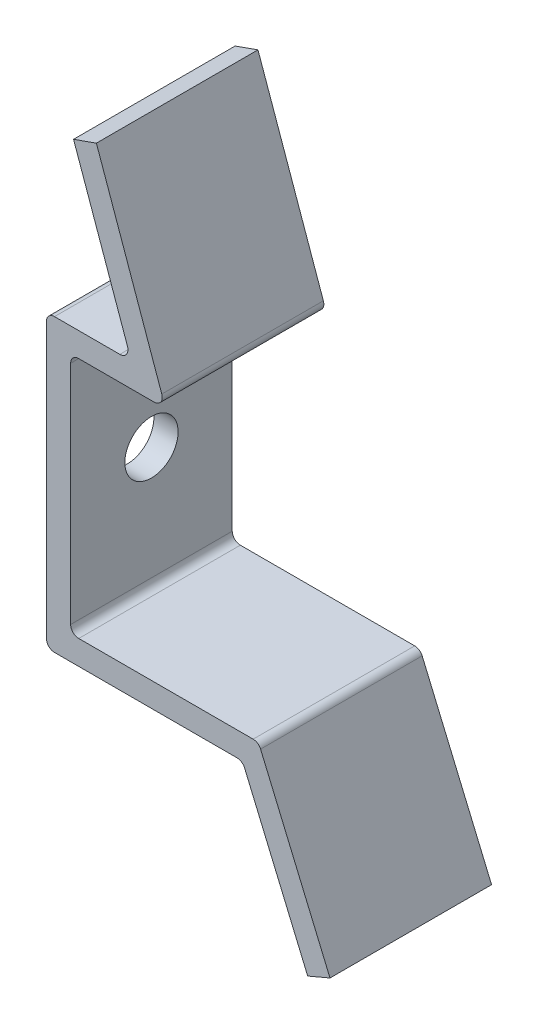
ISO-10303-21;
HEADER;
FILE_DESCRIPTION(('STEP AP214'),'2;1');
FILE_NAME('part.step','',(''),(''),'','','');
FILE_SCHEMA(('AUTOMOTIVE_DESIGN { 1 0 10303 214 1 1 1 1 }'));
ENDSEC;
DATA;
#1=APPLICATION_CONTEXT('core data for automotive mechanical design processes');
#2=APPLICATION_PROTOCOL_DEFINITION('international standard','automotive_design',2000,#1);
#3=PRODUCT_CONTEXT('',#1,'mechanical');
#4=PRODUCT('Part','Part','',(#3));
#5=PRODUCT_RELATED_PRODUCT_CATEGORY('part','',(#4));
#6=PRODUCT_DEFINITION_FORMATION('','',#4);
#7=PRODUCT_DEFINITION_CONTEXT('part definition',#1,'design');
#8=PRODUCT_DEFINITION('design','',#6,#7);
#9=PRODUCT_DEFINITION_SHAPE('','',#8);
#10=(LENGTH_UNIT() NAMED_UNIT(*) SI_UNIT(.MILLI.,.METRE.));
#11=(NAMED_UNIT(*) PLANE_ANGLE_UNIT() SI_UNIT($,.RADIAN.));
#12=(NAMED_UNIT(*) SI_UNIT($,.STERADIAN.) SOLID_ANGLE_UNIT());
#13=UNCERTAINTY_MEASURE_WITH_UNIT(LENGTH_MEASURE(1.E-05),#10,'distance_accuracy_value','');
#14=(GEOMETRIC_REPRESENTATION_CONTEXT(3) GLOBAL_UNCERTAINTY_ASSIGNED_CONTEXT((#13)) GLOBAL_UNIT_ASSIGNED_CONTEXT((#10,
#11,#12)) REPRESENTATION_CONTEXT('',''));
#15=CARTESIAN_POINT('',(0.,0.,0.));
#16=DIRECTION('',(0.,0.,1.));
#17=DIRECTION('',(1.,0.,0.));
#18=AXIS2_PLACEMENT_3D('',#15,#16,#17);
#19=CARTESIAN_POINT('',(32.3375851784551,-37.0193659405596,-10.));
#20=DIRECTION('',(0.390731128489272,-0.920504853452441,0.));
#21=DIRECTION('',(0.920504853452441,0.390731128489272,0.));
#22=AXIS2_PLACEMENT_3D('',#19,#20,#21);
#23=PLANE('',#22);
#24=DIRECTION('',(0.,0.,1.));
#25=VECTOR('',#24,1.);
#26=CARTESIAN_POINT('',(35.0990997388124,-35.8471725550917,-10.));
#27=LINE('',#26,#25);
#28=CARTESIAN_POINT('',(35.0990997388124,-35.8471725550917,-10.));
#29=VERTEX_POINT('',#28);
#30=CARTESIAN_POINT('',(35.0990997388124,-35.8471725550917,10.));
#31=VERTEX_POINT('',#30);
#32=EDGE_CURVE('E37',#29,#31,#27,.T.);
#33=ORIENTED_EDGE('',*,*,#32,.T.);
#34=DIRECTION('',(0.920504853452441,0.390731128489272,0.));
#35=VECTOR('',#34,1.);
#36=CARTESIAN_POINT('',(32.3375851784551,-37.0193659405596,10.));
#37=LINE('',#36,#35);
#38=CARTESIAN_POINT('',(32.3375851784551,-37.0193659405596,10.));
#39=VERTEX_POINT('',#38);
#40=EDGE_CURVE('E170',#39,#31,#37,.T.);
#41=ORIENTED_EDGE('',*,*,#40,.F.);
#42=DIRECTION('',(0.,0.,1.));
#43=VECTOR('',#42,1.);
#44=CARTESIAN_POINT('',(32.3375851784551,-37.0193659405596,-10.));
#45=LINE('',#44,#43);
#46=CARTESIAN_POINT('',(32.3375851784551,-37.0193659405596,-10.));
#47=VERTEX_POINT('',#46);
#48=EDGE_CURVE('E11',#47,#39,#45,.T.);
#49=ORIENTED_EDGE('',*,*,#48,.F.);
#50=DIRECTION('',(0.920504853452441,0.390731128489272,0.));
#51=VECTOR('',#50,1.);
#52=CARTESIAN_POINT('',(32.3375851784551,-37.0193659405596,-10.));
#53=LINE('',#52,#51);
#54=EDGE_CURVE('E171',#47,#29,#53,.T.);
#55=ORIENTED_EDGE('',*,*,#54,.T.);
#56=EDGE_LOOP('',(#33,#41,#49,#55));
#57=FACE_BOUND('',#56,.T.);
#58=ADVANCED_FACE('F34',(#57),#23,.T.);
#59=CARTESIAN_POINT('',(24.5229626086697,-18.6092688715107,-10.));
#60=DIRECTION('',(-0.920504853452441,-0.390731128489271,0.));
#61=DIRECTION('',(0.390731128489271,-0.920504853452441,0.));
#62=AXIS2_PLACEMENT_3D('',#59,#60,#61);
#63=PLANE('',#62);
#64=ORIENTED_EDGE('',*,*,#48,.T.);
#65=DIRECTION('',(0.390731128489271,-0.920504853452441,0.));
#66=VECTOR('',#65,1.);
#67=CARTESIAN_POINT('',(24.5229626086697,-18.6092688715107,10.));
#68=LINE('',#67,#66);
#69=CARTESIAN_POINT('',(24.5229626086697,-18.6092688715107,10.));
#70=VERTEX_POINT('',#69);
#71=EDGE_CURVE('E188',#70,#39,#68,.T.);
#72=ORIENTED_EDGE('',*,*,#71,.F.);
#73=DIRECTION('',(0.,0.,1.));
#74=VECTOR('',#73,1.);
#75=CARTESIAN_POINT('',(24.5229626086697,-18.6092688715107,-10.));
#76=LINE('',#75,#74);
#77=CARTESIAN_POINT('',(24.5229626086697,-18.6092688715107,-10.));
#78=VERTEX_POINT('',#77);
#79=EDGE_CURVE('E42',#78,#70,#76,.T.);
#80=ORIENTED_EDGE('',*,*,#79,.F.);
#81=DIRECTION('',(0.390731128489271,-0.920504853452441,0.));
#82=VECTOR('',#81,1.);
#83=CARTESIAN_POINT('',(24.5229626086697,-18.6092688715107,-10.));
#84=LINE('',#83,#82);
#85=EDGE_CURVE('E176',#78,#47,#84,.T.);
#86=ORIENTED_EDGE('',*,*,#85,.T.);
#87=EDGE_LOOP('',(#64,#72,#80,#86));
#88=FACE_BOUND('',#87,.T.);
#89=ADVANCED_FACE('F401',(#88),#63,.T.);
#90=CARTESIAN_POINT('',(23.6024577552172,-19.,-10.));
#91=DIRECTION('',(0.,0.,1.));
#92=DIRECTION('',(1.,0.,0.));
#93=AXIS2_PLACEMENT_3D('',#90,#91,#92);
#94=CYLINDRICAL_SURFACE('',#93,1.);
#95=ORIENTED_EDGE('',*,*,#79,.T.);
#96=CARTESIAN_POINT('',(23.6024577552172,-19.,10.));
#97=DIRECTION('',(0.,0.,-1.));
#98=DIRECTION('',(-1.,0.,0.));
#99=AXIS2_PLACEMENT_3D('',#96,#97,#98);
#100=CIRCLE('',#99,1.);
#101=CARTESIAN_POINT('',(23.6024577552172,-18.,10.));
#102=VERTEX_POINT('',#101);
#103=EDGE_CURVE('E242',#102,#70,#100,.T.);
#104=ORIENTED_EDGE('',*,*,#103,.F.);
#105=DIRECTION('',(0.,0.,1.));
#106=VECTOR('',#105,1.);
#107=CARTESIAN_POINT('',(23.6024577552172,-18.,-10.));
#108=LINE('',#107,#106);
#109=CARTESIAN_POINT('',(23.6024577552172,-18.,-10.));
#110=VERTEX_POINT('',#109);
#111=EDGE_CURVE('E300',#110,#102,#108,.T.);
#112=ORIENTED_EDGE('',*,*,#111,.F.);
#113=CARTESIAN_POINT('',(23.6024577552172,-19.,-10.));
#114=DIRECTION('',(0.,0.,-1.));
#115=DIRECTION('',(-1.,0.,0.));
#116=AXIS2_PLACEMENT_3D('',#113,#114,#115);
#117=CIRCLE('',#116,1.);
#118=EDGE_CURVE('E296',#110,#78,#117,.T.);
#119=ORIENTED_EDGE('',*,*,#118,.T.);
#120=EDGE_LOOP('',(#95,#104,#112,#119));
#121=FACE_BOUND('',#120,.T.);
#122=ADVANCED_FACE('F400',(#121),#94,.F.);
#123=CARTESIAN_POINT('',(1.00000000000001,-18.,-10.));
#124=DIRECTION('',(0.,-1.,0.));
#125=DIRECTION('',(0.,0.,-1.));
#126=AXIS2_PLACEMENT_3D('',#123,#124,#125);
#127=PLANE('',#126);
#128=ORIENTED_EDGE('',*,*,#111,.T.);
#129=DIRECTION('',(1.,0.,0.));
#130=VECTOR('',#129,1.);
#131=CARTESIAN_POINT('',(1.00000000000001,-18.,10.));
#132=LINE('',#131,#130);
#133=CARTESIAN_POINT('',(1.00000000000001,-18.,10.));
#134=VERTEX_POINT('',#133);
#135=EDGE_CURVE('E239',#134,#102,#132,.T.);
#136=ORIENTED_EDGE('',*,*,#135,.F.);
#137=DIRECTION('',(0.,0.,1.));
#138=VECTOR('',#137,1.);
#139=CARTESIAN_POINT('',(1.00000000000001,-18.,-10.));
#140=LINE('',#139,#138);
#141=CARTESIAN_POINT('',(1.00000000000001,-18.,-10.));
#142=VERTEX_POINT('',#141);
#143=EDGE_CURVE('E302',#142,#134,#140,.T.);
#144=ORIENTED_EDGE('',*,*,#143,.F.);
#145=DIRECTION('',(1.,0.,0.));
#146=VECTOR('',#145,1.);
#147=CARTESIAN_POINT('',(1.00000000000001,-18.,-10.));
#148=LINE('',#147,#146);
#149=EDGE_CURVE('E293',#142,#110,#148,.T.);
#150=ORIENTED_EDGE('',*,*,#149,.T.);
#151=EDGE_LOOP('',(#128,#136,#144,#150));
#152=FACE_BOUND('',#151,.T.);
#153=ADVANCED_FACE('F396',(#152),#127,.T.);
#154=CARTESIAN_POINT('',(1.,-17.,-10.));
#155=DIRECTION('',(0.,0.,1.));
#156=DIRECTION('',(1.,0.,0.));
#157=AXIS2_PLACEMENT_3D('',#154,#155,#156);
#158=CYLINDRICAL_SURFACE('',#157,1.);
#159=ORIENTED_EDGE('',*,*,#143,.T.);
#160=CARTESIAN_POINT('',(1.,-17.,10.));
#161=DIRECTION('',(0.,0.,1.));
#162=DIRECTION('',(1.,0.,0.));
#163=AXIS2_PLACEMENT_3D('',#160,#161,#162);
#164=CIRCLE('',#163,1.);
#165=CARTESIAN_POINT('',(0.,-17.,10.));
#166=VERTEX_POINT('',#165);
#167=EDGE_CURVE('E236',#166,#134,#164,.T.);
#168=ORIENTED_EDGE('',*,*,#167,.F.);
#169=DIRECTION('',(0.,0.,1.));
#170=VECTOR('',#169,1.);
#171=CARTESIAN_POINT('',(0.,-17.,-10.));
#172=LINE('',#171,#170);
#173=CARTESIAN_POINT('',(0.,-17.,-10.));
#174=VERTEX_POINT('',#173);
#175=EDGE_CURVE('E304',#174,#166,#172,.T.);
#176=ORIENTED_EDGE('',*,*,#175,.F.);
#177=CARTESIAN_POINT('',(1.,-17.,-10.));
#178=DIRECTION('',(0.,0.,1.));
#179=DIRECTION('',(1.,0.,0.));
#180=AXIS2_PLACEMENT_3D('',#177,#178,#179);
#181=CIRCLE('',#180,1.);
#182=EDGE_CURVE('E290',#174,#142,#181,.T.);
#183=ORIENTED_EDGE('',*,*,#182,.T.);
#184=EDGE_LOOP('',(#159,#168,#176,#183));
#185=FACE_BOUND('',#184,.T.);
#186=ADVANCED_FACE('F391',(#185),#158,.T.);
#187=CARTESIAN_POINT('',(0.,17.,-10.));
#188=DIRECTION('',(-1.,0.,0.));
#189=DIRECTION('',(0.,-1.,0.));
#190=AXIS2_PLACEMENT_3D('',#187,#188,#189);
#191=PLANE('',#190);
#192=CARTESIAN_POINT('',(0.,0.,0.));
#193=DIRECTION('',(-1.,0.,0.));
#194=DIRECTION('',(0.,0.,1.));
#195=AXIS2_PLACEMENT_3D('',#192,#193,#194);
#196=CIRCLE('',#195,3.29999999999989);
#197=CARTESIAN_POINT('',(0.,0.,3.29999999999989));
#198=VERTEX_POINT('',#197);
#199=EDGE_CURVE('E192',#198,#198,#196,.T.);
#200=ORIENTED_EDGE('',*,*,#199,.F.);
#201=EDGE_LOOP('',(#200));
#202=FACE_BOUND('',#201,.T.);
#203=ORIENTED_EDGE('',*,*,#175,.T.);
#204=DIRECTION('',(0.,-1.,0.));
#205=VECTOR('',#204,1.);
#206=CARTESIAN_POINT('',(0.,17.,10.));
#207=LINE('',#206,#205);
#208=CARTESIAN_POINT('',(0.,17.,10.));
#209=VERTEX_POINT('',#208);
#210=EDGE_CURVE('E233',#209,#166,#207,.T.);
#211=ORIENTED_EDGE('',*,*,#210,.F.);
#212=DIRECTION('',(0.,0.,1.));
#213=VECTOR('',#212,1.);
#214=CARTESIAN_POINT('',(0.,17.,-10.));
#215=LINE('',#214,#213);
#216=CARTESIAN_POINT('',(0.,17.,-10.));
#217=VERTEX_POINT('',#216);
#218=EDGE_CURVE('E306',#217,#209,#215,.T.);
#219=ORIENTED_EDGE('',*,*,#218,.F.);
#220=DIRECTION('',(0.,-1.,0.));
#221=VECTOR('',#220,1.);
#222=CARTESIAN_POINT('',(0.,17.,-10.));
#223=LINE('',#222,#221);
#224=EDGE_CURVE('E287',#217,#174,#223,.T.);
#225=ORIENTED_EDGE('',*,*,#224,.T.);
#226=EDGE_LOOP('',(#203,#211,#219,#225));
#227=FACE_BOUND('',#226,.T.);
#228=ADVANCED_FACE('F389',(#202,#227),#191,.T.);
#229=CARTESIAN_POINT('',(1.,17.,-10.));
#230=DIRECTION('',(0.,0.,1.));
#231=DIRECTION('',(1.,0.,0.));
#232=AXIS2_PLACEMENT_3D('',#229,#230,#231);
#233=CYLINDRICAL_SURFACE('',#232,1.);
#234=ORIENTED_EDGE('',*,*,#218,.T.);
#235=CARTESIAN_POINT('',(1.,17.,10.));
#236=DIRECTION('',(0.,0.,1.));
#237=DIRECTION('',(-1.,0.,0.));
#238=AXIS2_PLACEMENT_3D('',#235,#236,#237);
#239=CIRCLE('',#238,1.);
#240=CARTESIAN_POINT('',(1.00000000000001,18.,10.));
#241=VERTEX_POINT('',#240);
#242=EDGE_CURVE('E230',#241,#209,#239,.T.);
#243=ORIENTED_EDGE('',*,*,#242,.F.);
#244=DIRECTION('',(0.,0.,1.));
#245=VECTOR('',#244,1.);
#246=CARTESIAN_POINT('',(1.00000000000001,18.,-10.));
#247=LINE('',#246,#245);
#248=CARTESIAN_POINT('',(1.00000000000001,18.,-10.));
#249=VERTEX_POINT('',#248);
#250=EDGE_CURVE('E308',#249,#241,#247,.T.);
#251=ORIENTED_EDGE('',*,*,#250,.F.);
#252=CARTESIAN_POINT('',(1.,17.,-10.));
#253=DIRECTION('',(0.,0.,1.));
#254=DIRECTION('',(-1.,0.,0.));
#255=AXIS2_PLACEMENT_3D('',#252,#253,#254);
#256=CIRCLE('',#255,1.);
#257=EDGE_CURVE('E284',#249,#217,#256,.T.);
#258=ORIENTED_EDGE('',*,*,#257,.T.);
#259=EDGE_LOOP('',(#234,#243,#251,#258));
#260=FACE_BOUND('',#259,.T.);
#261=ADVANCED_FACE('F384',(#260),#233,.T.);
#262=CARTESIAN_POINT('',(9.09013091153718,18.,-10.));
#263=DIRECTION('',(0.,1.,0.));
#264=DIRECTION('',(0.,0.,1.));
#265=AXIS2_PLACEMENT_3D('',#262,#263,#264);
#266=PLANE('',#265);
#267=ORIENTED_EDGE('',*,*,#250,.T.);
#268=DIRECTION('',(-1.,0.,0.));
#269=VECTOR('',#268,1.);
#270=CARTESIAN_POINT('',(9.09013091153718,18.,10.));
#271=LINE('',#270,#269);
#272=CARTESIAN_POINT('',(9.09013091153718,18.,10.));
#273=VERTEX_POINT('',#272);
#274=EDGE_CURVE('E227',#273,#241,#271,.T.);
#275=ORIENTED_EDGE('',*,*,#274,.F.);
#276=DIRECTION('',(0.,0.,1.));
#277=VECTOR('',#276,1.);
#278=CARTESIAN_POINT('',(9.09013091153718,18.,-10.));
#279=LINE('',#278,#277);
#280=CARTESIAN_POINT('',(9.09013091153718,18.,-10.));
#281=VERTEX_POINT('',#280);
#282=EDGE_CURVE('E310',#281,#273,#279,.T.);
#283=ORIENTED_EDGE('',*,*,#282,.F.);
#284=DIRECTION('',(-1.,0.,0.));
#285=VECTOR('',#284,1.);
#286=CARTESIAN_POINT('',(9.09013091153718,18.,-10.));
#287=LINE('',#286,#285);
#288=EDGE_CURVE('E281',#281,#249,#287,.T.);
#289=ORIENTED_EDGE('',*,*,#288,.T.);
#290=EDGE_LOOP('',(#267,#275,#283,#289));
#291=FACE_BOUND('',#290,.T.);
#292=ADVANCED_FACE('F379',(#291),#266,.T.);
#293=CARTESIAN_POINT('',(9.09013091153719,19.,-10.));
#294=DIRECTION('',(0.,0.,1.));
#295=DIRECTION('',(1.,0.,0.));
#296=AXIS2_PLACEMENT_3D('',#293,#294,#295);
#297=CYLINDRICAL_SURFACE('',#296,1.);
#298=ORIENTED_EDGE('',*,*,#282,.T.);
#299=CARTESIAN_POINT('',(9.09013091153719,19.,10.));
#300=DIRECTION('',(0.,0.,-1.));
#301=DIRECTION('',(-1.,0.,0.));
#302=AXIS2_PLACEMENT_3D('',#299,#300,#301);
#303=CIRCLE('',#302,1.);
#304=CARTESIAN_POINT('',(10.0327724026294,19.3338068592338,10.));
#305=VERTEX_POINT('',#304);
#306=EDGE_CURVE('E224',#305,#273,#303,.T.);
#307=ORIENTED_EDGE('',*,*,#306,.F.);
#308=DIRECTION('',(0.,0.,1.));
#309=VECTOR('',#308,1.);
#310=CARTESIAN_POINT('',(10.0327724026294,19.3338068592338,-10.));
#311=LINE('',#310,#309);
#312=CARTESIAN_POINT('',(10.0327724026294,19.3338068592338,-10.));
#313=VERTEX_POINT('',#312);
#314=EDGE_CURVE('E312',#313,#305,#311,.T.);
#315=ORIENTED_EDGE('',*,*,#314,.F.);
#316=CARTESIAN_POINT('',(9.09013091153719,19.,-10.));
#317=DIRECTION('',(0.,0.,-1.));
#318=DIRECTION('',(-1.,0.,0.));
#319=AXIS2_PLACEMENT_3D('',#316,#317,#318);
#320=CIRCLE('',#319,1.);
#321=EDGE_CURVE('E278',#313,#281,#320,.T.);
#322=ORIENTED_EDGE('',*,*,#321,.T.);
#323=EDGE_LOOP('',(#298,#307,#315,#322));
#324=FACE_BOUND('',#323,.T.);
#325=ADVANCED_FACE('F377',(#324),#297,.F.);
#326=CARTESIAN_POINT('',(3.35663521795386,38.1866366810773,-10.));
#327=DIRECTION('',(-0.942641491092177,-0.333806859233775,0.));
#328=DIRECTION('',(0.333806859233775,-0.942641491092177,0.));
#329=AXIS2_PLACEMENT_3D('',#326,#327,#328);
#330=PLANE('',#329);
#331=ORIENTED_EDGE('',*,*,#314,.T.);
#332=DIRECTION('',(0.333806859233775,-0.942641491092177,0.));
#333=VECTOR('',#332,1.);
#334=CARTESIAN_POINT('',(3.35663521795386,38.1866366810773,10.));
#335=LINE('',#334,#333);
#336=CARTESIAN_POINT('',(3.35663521795386,38.1866366810773,10.));
#337=VERTEX_POINT('',#336);
#338=EDGE_CURVE('E221',#337,#305,#335,.T.);
#339=ORIENTED_EDGE('',*,*,#338,.F.);
#340=DIRECTION('',(0.,0.,1.));
#341=VECTOR('',#340,1.);
#342=CARTESIAN_POINT('',(3.35663521795386,38.1866366810773,-10.));
#343=LINE('',#342,#341);
#344=CARTESIAN_POINT('',(3.35663521795386,38.1866366810773,-10.));
#345=VERTEX_POINT('',#344);
#346=EDGE_CURVE('E314',#345,#337,#343,.T.);
#347=ORIENTED_EDGE('',*,*,#346,.F.);
#348=DIRECTION('',(0.333806859233775,-0.942641491092177,0.));
#349=VECTOR('',#348,1.);
#350=CARTESIAN_POINT('',(3.35663521795386,38.1866366810773,-10.));
#351=LINE('',#350,#349);
#352=EDGE_CURVE('E275',#345,#313,#351,.T.);
#353=ORIENTED_EDGE('',*,*,#352,.T.);
#354=EDGE_LOOP('',(#331,#339,#347,#353));
#355=FACE_BOUND('',#354,.T.);
#356=ADVANCED_FACE('F372',(#355),#330,.T.);
#357=CARTESIAN_POINT('',(6.18455969123039,39.1880572587786,-10.));
#358=DIRECTION('',(-0.333806859233776,0.942641491092177,0.));
#359=DIRECTION('',(-0.942641491092177,-0.333806859233776,0.));
#360=AXIS2_PLACEMENT_3D('',#357,#358,#359);
#361=PLANE('',#360);
#362=ORIENTED_EDGE('',*,*,#346,.T.);
#363=DIRECTION('',(-0.942641491092177,-0.333806859233776,0.));
#364=VECTOR('',#363,1.);
#365=CARTESIAN_POINT('',(6.18455969123039,39.1880572587786,10.));
#366=LINE('',#365,#364);
#367=CARTESIAN_POINT('',(6.18455969123039,39.1880572587786,10.));
#368=VERTEX_POINT('',#367);
#369=EDGE_CURVE('E218',#368,#337,#366,.T.);
#370=ORIENTED_EDGE('',*,*,#369,.F.);
#371=DIRECTION('',(0.,0.,1.));
#372=VECTOR('',#371,1.);
#373=CARTESIAN_POINT('',(6.18455969123039,39.1880572587786,-10.));
#374=LINE('',#373,#372);
#375=CARTESIAN_POINT('',(6.18455969123039,39.1880572587786,-10.));
#376=VERTEX_POINT('',#375);
#377=EDGE_CURVE('E316',#376,#368,#374,.T.);
#378=ORIENTED_EDGE('',*,*,#377,.F.);
#379=DIRECTION('',(-0.942641491092177,-0.333806859233776,0.));
#380=VECTOR('',#379,1.);
#381=CARTESIAN_POINT('',(6.18455969123039,39.1880572587786,-10.));
#382=LINE('',#381,#380);
#383=EDGE_CURVE('E272',#376,#345,#382,.T.);
#384=ORIENTED_EDGE('',*,*,#383,.T.);
#385=EDGE_LOOP('',(#362,#370,#378,#384));
#386=FACE_BOUND('',#385,.T.);
#387=ADVANCED_FACE('F367',(#386),#361,.T.);
#388=CARTESIAN_POINT('',(14.2776742189765,16.3338068592338,-10.));
#389=DIRECTION('',(0.942641491092177,0.333806859233776,0.));
#390=DIRECTION('',(-0.333806859233776,0.942641491092177,0.));
#391=AXIS2_PLACEMENT_3D('',#388,#389,#390);
#392=PLANE('',#391);
#393=ORIENTED_EDGE('',*,*,#377,.T.);
#394=DIRECTION('',(-0.333806859233776,0.942641491092177,0.));
#395=VECTOR('',#394,1.);
#396=CARTESIAN_POINT('',(14.2776742189765,16.3338068592338,10.));
#397=LINE('',#396,#395);
#398=CARTESIAN_POINT('',(14.2776742189765,16.3338068592338,10.));
#399=VERTEX_POINT('',#398);
#400=EDGE_CURVE('E215',#399,#368,#397,.T.);
#401=ORIENTED_EDGE('',*,*,#400,.F.);
#402=DIRECTION('',(0.,0.,1.));
#403=VECTOR('',#402,1.);
#404=CARTESIAN_POINT('',(14.2776742189765,16.3338068592338,-10.));
#405=LINE('',#404,#403);
#406=CARTESIAN_POINT('',(14.2776742189765,16.3338068592338,-10.));
#407=VERTEX_POINT('',#406);
#408=EDGE_CURVE('E318',#407,#399,#405,.T.);
#409=ORIENTED_EDGE('',*,*,#408,.F.);
#410=DIRECTION('',(-0.333806859233776,0.942641491092177,0.));
#411=VECTOR('',#410,1.);
#412=CARTESIAN_POINT('',(14.2776742189765,16.3338068592338,-10.));
#413=LINE('',#412,#411);
#414=EDGE_CURVE('E269',#407,#376,#413,.T.);
#415=ORIENTED_EDGE('',*,*,#414,.T.);
#416=EDGE_LOOP('',(#393,#401,#409,#415));
#417=FACE_BOUND('',#416,.T.);
#418=ADVANCED_FACE('F365',(#417),#392,.T.);
#419=CARTESIAN_POINT('',(13.3350327278843,16.,-10.));
#420=DIRECTION('',(0.,0.,1.));
#421=DIRECTION('',(1.,0.,0.));
#422=AXIS2_PLACEMENT_3D('',#419,#420,#421);
#423=CYLINDRICAL_SURFACE('',#422,1.);
#424=ORIENTED_EDGE('',*,*,#408,.T.);
#425=CARTESIAN_POINT('',(13.3350327278843,16.,10.));
#426=DIRECTION('',(0.,0.,1.));
#427=DIRECTION('',(1.,0.,0.));
#428=AXIS2_PLACEMENT_3D('',#425,#426,#427);
#429=CIRCLE('',#428,1.);
#430=CARTESIAN_POINT('',(13.3350327278843,15.,10.));
#431=VERTEX_POINT('',#430);
#432=EDGE_CURVE('E212',#431,#399,#429,.T.);
#433=ORIENTED_EDGE('',*,*,#432,.F.);
#434=DIRECTION('',(0.,0.,1.));
#435=VECTOR('',#434,1.);
#436=CARTESIAN_POINT('',(13.3350327278843,15.,-10.));
#437=LINE('',#436,#435);
#438=CARTESIAN_POINT('',(13.3350327278843,15.,-10.));
#439=VERTEX_POINT('',#438);
#440=EDGE_CURVE('E320',#439,#431,#437,.T.);
#441=ORIENTED_EDGE('',*,*,#440,.F.);
#442=CARTESIAN_POINT('',(13.3350327278843,16.,-10.));
#443=DIRECTION('',(0.,0.,1.));
#444=DIRECTION('',(1.,0.,0.));
#445=AXIS2_PLACEMENT_3D('',#442,#443,#444);
#446=CIRCLE('',#445,1.);
#447=EDGE_CURVE('E266',#439,#407,#446,.T.);
#448=ORIENTED_EDGE('',*,*,#447,.T.);
#449=EDGE_LOOP('',(#424,#433,#441,#448));
#450=FACE_BOUND('',#449,.T.);
#451=ADVANCED_FACE('F360',(#450),#423,.T.);
#452=CARTESIAN_POINT('',(4.00000000000001,15.,-10.));
#453=DIRECTION('',(0.,-1.,0.));
#454=DIRECTION('',(1.,0.,0.));
#455=AXIS2_PLACEMENT_3D('',#452,#453,#454);
#456=PLANE('',#455);
#457=ORIENTED_EDGE('',*,*,#440,.T.);
#458=DIRECTION('',(1.,0.,0.));
#459=VECTOR('',#458,1.);
#460=CARTESIAN_POINT('',(4.00000000000001,15.,10.));
#461=LINE('',#460,#459);
#462=CARTESIAN_POINT('',(4.00000000000001,15.,10.));
#463=VERTEX_POINT('',#462);
#464=EDGE_CURVE('E209',#463,#431,#461,.T.);
#465=ORIENTED_EDGE('',*,*,#464,.F.);
#466=DIRECTION('',(0.,0.,1.));
#467=VECTOR('',#466,1.);
#468=CARTESIAN_POINT('',(4.00000000000001,15.,-10.));
#469=LINE('',#468,#467);
#470=CARTESIAN_POINT('',(4.00000000000001,15.,-10.));
#471=VERTEX_POINT('',#470);
#472=EDGE_CURVE('E322',#471,#463,#469,.T.);
#473=ORIENTED_EDGE('',*,*,#472,.F.);
#474=DIRECTION('',(1.,0.,0.));
#475=VECTOR('',#474,1.);
#476=CARTESIAN_POINT('',(4.00000000000001,15.,-10.));
#477=LINE('',#476,#475);
#478=EDGE_CURVE('E263',#471,#439,#477,.T.);
#479=ORIENTED_EDGE('',*,*,#478,.T.);
#480=EDGE_LOOP('',(#457,#465,#473,#479));
#481=FACE_BOUND('',#480,.T.);
#482=ADVANCED_FACE('F355',(#481),#456,.T.);
#483=CARTESIAN_POINT('',(4.,14.,-10.));
#484=DIRECTION('',(0.,0.,1.));
#485=DIRECTION('',(1.,0.,0.));
#486=AXIS2_PLACEMENT_3D('',#483,#484,#485);
#487=CYLINDRICAL_SURFACE('',#486,0.999999999999999);
#488=ORIENTED_EDGE('',*,*,#472,.T.);
#489=CARTESIAN_POINT('',(4.,14.,10.));
#490=DIRECTION('',(0.,0.,-1.));
#491=DIRECTION('',(-1.,0.,0.));
#492=AXIS2_PLACEMENT_3D('',#489,#490,#491);
#493=CIRCLE('',#492,0.999999999999999);
#494=CARTESIAN_POINT('',(3.,14.,10.));
#495=VERTEX_POINT('',#494);
#496=EDGE_CURVE('E206',#495,#463,#493,.T.);
#497=ORIENTED_EDGE('',*,*,#496,.F.);
#498=DIRECTION('',(0.,0.,1.));
#499=VECTOR('',#498,1.);
#500=CARTESIAN_POINT('',(3.,14.,-10.));
#501=LINE('',#500,#499);
#502=CARTESIAN_POINT('',(3.,14.,-10.));
#503=VERTEX_POINT('',#502);
#504=EDGE_CURVE('E324',#503,#495,#501,.T.);
#505=ORIENTED_EDGE('',*,*,#504,.F.);
#506=CARTESIAN_POINT('',(4.,14.,-10.));
#507=DIRECTION('',(0.,0.,-1.));
#508=DIRECTION('',(-1.,0.,0.));
#509=AXIS2_PLACEMENT_3D('',#506,#507,#508);
#510=CIRCLE('',#509,0.999999999999999);
#511=EDGE_CURVE('E260',#503,#471,#510,.T.);
#512=ORIENTED_EDGE('',*,*,#511,.T.);
#513=EDGE_LOOP('',(#488,#497,#505,#512));
#514=FACE_BOUND('',#513,.T.);
#515=ADVANCED_FACE('F353',(#514),#487,.F.);
#516=CARTESIAN_POINT('',(3.,-14.,-10.));
#517=DIRECTION('',(1.,0.,0.));
#518=DIRECTION('',(0.,0.,-1.));
#519=AXIS2_PLACEMENT_3D('',#516,#517,#518);
#520=PLANE('',#519);
#521=CARTESIAN_POINT('',(3.,0.,0.));
#522=DIRECTION('',(1.,0.,0.));
#523=DIRECTION('',(0.,0.,-1.));
#524=AXIS2_PLACEMENT_3D('',#521,#522,#523);
#525=CIRCLE('',#524,3.29999999999994);
#526=CARTESIAN_POINT('',(3.,0.,-3.29999999999994));
#527=VERTEX_POINT('',#526);
#528=EDGE_CURVE('E189',#527,#527,#525,.T.);
#529=ORIENTED_EDGE('',*,*,#528,.F.);
#530=EDGE_LOOP('',(#529));
#531=FACE_BOUND('',#530,.T.);
#532=ORIENTED_EDGE('',*,*,#504,.T.);
#533=DIRECTION('',(0.,1.,0.));
#534=VECTOR('',#533,1.);
#535=CARTESIAN_POINT('',(3.,-14.,10.));
#536=LINE('',#535,#534);
#537=CARTESIAN_POINT('',(3.,-14.,10.));
#538=VERTEX_POINT('',#537);
#539=EDGE_CURVE('E203',#538,#495,#536,.T.);
#540=ORIENTED_EDGE('',*,*,#539,.F.);
#541=DIRECTION('',(0.,0.,1.));
#542=VECTOR('',#541,1.);
#543=CARTESIAN_POINT('',(3.,-14.,-10.));
#544=LINE('',#543,#542);
#545=CARTESIAN_POINT('',(3.,-14.,-10.));
#546=VERTEX_POINT('',#545);
#547=EDGE_CURVE('E326',#546,#538,#544,.T.);
#548=ORIENTED_EDGE('',*,*,#547,.F.);
#549=DIRECTION('',(0.,1.,0.));
#550=VECTOR('',#549,1.);
#551=CARTESIAN_POINT('',(3.,-14.,-10.));
#552=LINE('',#551,#550);
#553=EDGE_CURVE('E257',#546,#503,#552,.T.);
#554=ORIENTED_EDGE('',*,*,#553,.T.);
#555=EDGE_LOOP('',(#532,#540,#548,#554));
#556=FACE_BOUND('',#555,.T.);
#557=ADVANCED_FACE('F348',(#531,#556),#520,.T.);
#558=CARTESIAN_POINT('',(4.,-14.,-10.));
#559=DIRECTION('',(0.,0.,1.));
#560=DIRECTION('',(1.,0.,0.));
#561=AXIS2_PLACEMENT_3D('',#558,#559,#560);
#562=CYLINDRICAL_SURFACE('',#561,0.999999999999999);
#563=ORIENTED_EDGE('',*,*,#547,.T.);
#564=CARTESIAN_POINT('',(4.,-14.,10.));
#565=DIRECTION('',(0.,0.,-1.));
#566=DIRECTION('',(-1.,0.,0.));
#567=AXIS2_PLACEMENT_3D('',#564,#565,#566);
#568=CIRCLE('',#567,0.999999999999999);
#569=CARTESIAN_POINT('',(4.00000000000001,-15.,10.));
#570=VERTEX_POINT('',#569);
#571=EDGE_CURVE('E200',#570,#538,#568,.T.);
#572=ORIENTED_EDGE('',*,*,#571,.F.);
#573=DIRECTION('',(0.,0.,1.));
#574=VECTOR('',#573,1.);
#575=CARTESIAN_POINT('',(4.00000000000001,-15.,-10.));
#576=LINE('',#575,#574);
#577=CARTESIAN_POINT('',(4.00000000000001,-15.,-10.));
#578=VERTEX_POINT('',#577);
#579=EDGE_CURVE('E328',#578,#570,#576,.T.);
#580=ORIENTED_EDGE('',*,*,#579,.F.);
#581=CARTESIAN_POINT('',(4.,-14.,-10.));
#582=DIRECTION('',(0.,0.,-1.));
#583=DIRECTION('',(-1.,0.,0.));
#584=AXIS2_PLACEMENT_3D('',#581,#582,#583);
#585=CIRCLE('',#584,0.999999999999999);
#586=EDGE_CURVE('E254',#578,#546,#585,.T.);
#587=ORIENTED_EDGE('',*,*,#586,.T.);
#588=EDGE_LOOP('',(#563,#572,#580,#587));
#589=FACE_BOUND('',#588,.T.);
#590=ADVANCED_FACE('F341',(#589),#562,.F.);
#591=CARTESIAN_POINT('',(25.5881144388043,-15.,-10.));
#592=DIRECTION('',(0.,1.,0.));
#593=DIRECTION('',(-1.,0.,0.));
#594=AXIS2_PLACEMENT_3D('',#591,#592,#593);
#595=PLANE('',#594);
#596=ORIENTED_EDGE('',*,*,#579,.T.);
#597=DIRECTION('',(-1.,0.,0.));
#598=VECTOR('',#597,1.);
#599=CARTESIAN_POINT('',(25.5881144388043,-15.,10.));
#600=LINE('',#599,#598);
#601=CARTESIAN_POINT('',(25.5881144388043,-15.,10.));
#602=VERTEX_POINT('',#601);
#603=EDGE_CURVE('E197',#602,#570,#600,.T.);
#604=ORIENTED_EDGE('',*,*,#603,.F.);
#605=DIRECTION('',(0.,0.,1.));
#606=VECTOR('',#605,1.);
#607=CARTESIAN_POINT('',(25.5881144388043,-15.,-10.));
#608=LINE('',#607,#606);
#609=CARTESIAN_POINT('',(25.5881144388043,-15.,-10.));
#610=VERTEX_POINT('',#609);
#611=EDGE_CURVE('E330',#610,#602,#608,.T.);
#612=ORIENTED_EDGE('',*,*,#611,.F.);
#613=DIRECTION('',(-1.,0.,0.));
#614=VECTOR('',#613,1.);
#615=CARTESIAN_POINT('',(25.5881144388043,-15.,-10.));
#616=LINE('',#615,#614);
#617=EDGE_CURVE('E251',#610,#578,#616,.T.);
#618=ORIENTED_EDGE('',*,*,#617,.T.);
#619=EDGE_LOOP('',(#596,#604,#612,#618));
#620=FACE_BOUND('',#619,.T.);
#621=ADVANCED_FACE('F338',(#620),#595,.T.);
#622=CARTESIAN_POINT('',(25.5881144388043,-16.,-10.));
#623=DIRECTION('',(0.,0.,1.));
#624=DIRECTION('',(1.,0.,0.));
#625=AXIS2_PLACEMENT_3D('',#622,#623,#624);
#626=CYLINDRICAL_SURFACE('',#625,1.);
#627=ORIENTED_EDGE('',*,*,#611,.T.);
#628=CARTESIAN_POINT('',(25.5881144388043,-16.,10.));
#629=DIRECTION('',(0.,0.,1.));
#630=DIRECTION('',(1.,0.,0.));
#631=AXIS2_PLACEMENT_3D('',#628,#629,#630);
#632=CIRCLE('',#631,1.);
#633=CARTESIAN_POINT('',(26.5086192922568,-15.6092688715107,10.));
#634=VERTEX_POINT('',#633);
#635=EDGE_CURVE('E183',#634,#602,#632,.T.);
#636=ORIENTED_EDGE('',*,*,#635,.F.);
#637=DIRECTION('',(0.,0.,1.));
#638=VECTOR('',#637,1.);
#639=CARTESIAN_POINT('',(26.5086192922568,-15.6092688715107,-10.));
#640=LINE('',#639,#638);
#641=CARTESIAN_POINT('',(26.5086192922568,-15.6092688715107,-10.));
#642=VERTEX_POINT('',#641);
#643=EDGE_CURVE('E175',#642,#634,#640,.T.);
#644=ORIENTED_EDGE('',*,*,#643,.F.);
#645=CARTESIAN_POINT('',(25.5881144388043,-16.,-10.));
#646=DIRECTION('',(0.,0.,1.));
#647=DIRECTION('',(1.,0.,0.));
#648=AXIS2_PLACEMENT_3D('',#645,#646,#647);
#649=CIRCLE('',#648,1.);
#650=EDGE_CURVE('E248',#642,#610,#649,.T.);
#651=ORIENTED_EDGE('',*,*,#650,.T.);
#652=EDGE_LOOP('',(#627,#636,#644,#651));
#653=FACE_BOUND('',#652,.T.);
#654=ADVANCED_FACE('F332',(#653),#626,.T.);
#655=CARTESIAN_POINT('',(35.0990997388124,-35.8471725550917,-10.));
#656=DIRECTION('',(0.920504853452441,0.390731128489272,0.));
#657=DIRECTION('',(-0.390731128489272,0.920504853452441,0.));
#658=AXIS2_PLACEMENT_3D('',#655,#656,#657);
#659=PLANE('',#658);
#660=ORIENTED_EDGE('',*,*,#643,.T.);
#661=DIRECTION('',(-0.390731128489271,0.920504853452441,0.));
#662=VECTOR('',#661,1.);
#663=CARTESIAN_POINT('',(35.0990997388124,-35.8471725550917,10.));
#664=LINE('',#663,#662);
#665=EDGE_CURVE('E178',#31,#634,#664,.T.);
#666=ORIENTED_EDGE('',*,*,#665,.F.);
#667=ORIENTED_EDGE('',*,*,#32,.F.);
#668=DIRECTION('',(-0.390731128489271,0.920504853452441,0.));
#669=VECTOR('',#668,1.);
#670=CARTESIAN_POINT('',(35.0990997388124,-35.8471725550917,-10.));
#671=LINE('',#670,#669);
#672=EDGE_CURVE('E246',#29,#642,#671,.T.);
#673=ORIENTED_EDGE('',*,*,#672,.T.);
#674=EDGE_LOOP('',(#660,#666,#667,#673));
#675=FACE_BOUND('',#674,.T.);
#676=ADVANCED_FACE('F179',(#675),#659,.T.);
#677=CARTESIAN_POINT('',(25.5881144388043,-16.,-10.));
#678=DIRECTION('',(0.,0.,1.));
#679=DIRECTION('',(1.,0.,0.));
#680=AXIS2_PLACEMENT_3D('',#677,#678,#679);
#681=PLANE('',#680);
#682=ORIENTED_EDGE('',*,*,#54,.F.);
#683=ORIENTED_EDGE('',*,*,#85,.F.);
#684=ORIENTED_EDGE('',*,*,#118,.F.);
#685=ORIENTED_EDGE('',*,*,#149,.F.);
#686=ORIENTED_EDGE('',*,*,#182,.F.);
#687=ORIENTED_EDGE('',*,*,#224,.F.);
#688=ORIENTED_EDGE('',*,*,#257,.F.);
#689=ORIENTED_EDGE('',*,*,#288,.F.);
#690=ORIENTED_EDGE('',*,*,#321,.F.);
#691=ORIENTED_EDGE('',*,*,#352,.F.);
#692=ORIENTED_EDGE('',*,*,#383,.F.);
#693=ORIENTED_EDGE('',*,*,#414,.F.);
#694=ORIENTED_EDGE('',*,*,#447,.F.);
#695=ORIENTED_EDGE('',*,*,#478,.F.);
#696=ORIENTED_EDGE('',*,*,#511,.F.);
#697=ORIENTED_EDGE('',*,*,#553,.F.);
#698=ORIENTED_EDGE('',*,*,#586,.F.);
#699=ORIENTED_EDGE('',*,*,#617,.F.);
#700=ORIENTED_EDGE('',*,*,#650,.F.);
#701=ORIENTED_EDGE('',*,*,#672,.F.);
#702=EDGE_LOOP('',(#682,#683,#684,#685,#686,#687,#688,#689,#690,#691,#692,#693,#694,#695,#696,
#697,#698,#699,#700,#701));
#703=FACE_BOUND('',#702,.T.);
#704=ADVANCED_FACE('F344',(#703),#681,.F.);
#705=CARTESIAN_POINT('',(25.5881144388043,-16.,10.));
#706=DIRECTION('',(0.,0.,1.));
#707=DIRECTION('',(1.,0.,0.));
#708=AXIS2_PLACEMENT_3D('',#705,#706,#707);
#709=PLANE('',#708);
#710=ORIENTED_EDGE('',*,*,#40,.T.);
#711=ORIENTED_EDGE('',*,*,#665,.T.);
#712=ORIENTED_EDGE('',*,*,#635,.T.);
#713=ORIENTED_EDGE('',*,*,#603,.T.);
#714=ORIENTED_EDGE('',*,*,#571,.T.);
#715=ORIENTED_EDGE('',*,*,#539,.T.);
#716=ORIENTED_EDGE('',*,*,#496,.T.);
#717=ORIENTED_EDGE('',*,*,#464,.T.);
#718=ORIENTED_EDGE('',*,*,#432,.T.);
#719=ORIENTED_EDGE('',*,*,#400,.T.);
#720=ORIENTED_EDGE('',*,*,#369,.T.);
#721=ORIENTED_EDGE('',*,*,#338,.T.);
#722=ORIENTED_EDGE('',*,*,#306,.T.);
#723=ORIENTED_EDGE('',*,*,#274,.T.);
#724=ORIENTED_EDGE('',*,*,#242,.T.);
#725=ORIENTED_EDGE('',*,*,#210,.T.);
#726=ORIENTED_EDGE('',*,*,#167,.T.);
#727=ORIENTED_EDGE('',*,*,#135,.T.);
#728=ORIENTED_EDGE('',*,*,#103,.T.);
#729=ORIENTED_EDGE('',*,*,#71,.T.);
#730=EDGE_LOOP('',(#710,#711,#712,#713,#714,#715,#716,#717,#718,#719,#720,#721,#722,#723,#724,
#725,#726,#727,#728,#729));
#731=FACE_BOUND('',#730,.T.);
#732=ADVANCED_FACE('F186',(#731),#709,.T.);
#733=CARTESIAN_POINT('',(0.,0.,0.));
#734=DIRECTION('',(-1.,0.,0.));
#735=DIRECTION('',(0.,0.,1.));
#736=AXIS2_PLACEMENT_3D('',#733,#734,#735);
#737=CYLINDRICAL_SURFACE('',#736,3.29999999999994);
#738=ORIENTED_EDGE('',*,*,#528,.T.);
#739=EDGE_LOOP('',(#738));
#740=FACE_BOUND('',#739,.T.);
#741=ORIENTED_EDGE('',*,*,#199,.T.);
#742=EDGE_LOOP('',(#741));
#743=FACE_BOUND('',#742,.T.);
#744=ADVANCED_FACE('F452',(#740,#743),#737,.F.);
#745=CLOSED_SHELL('',(#58,#89,#122,#153,#186,#228,#261,#292,#325,#356,#387,#418,#451,#482,#515,
#557,#590,#621,#654,#676,#704,#732,#744));
#746=MANIFOLD_SOLID_BREP('B2',#745);
#747=ADVANCED_BREP_SHAPE_REPRESENTATION('',(#18,#746),#14);
#748=SHAPE_DEFINITION_REPRESENTATION(#9,#747);
ENDSEC;
END-ISO-10303-21;
